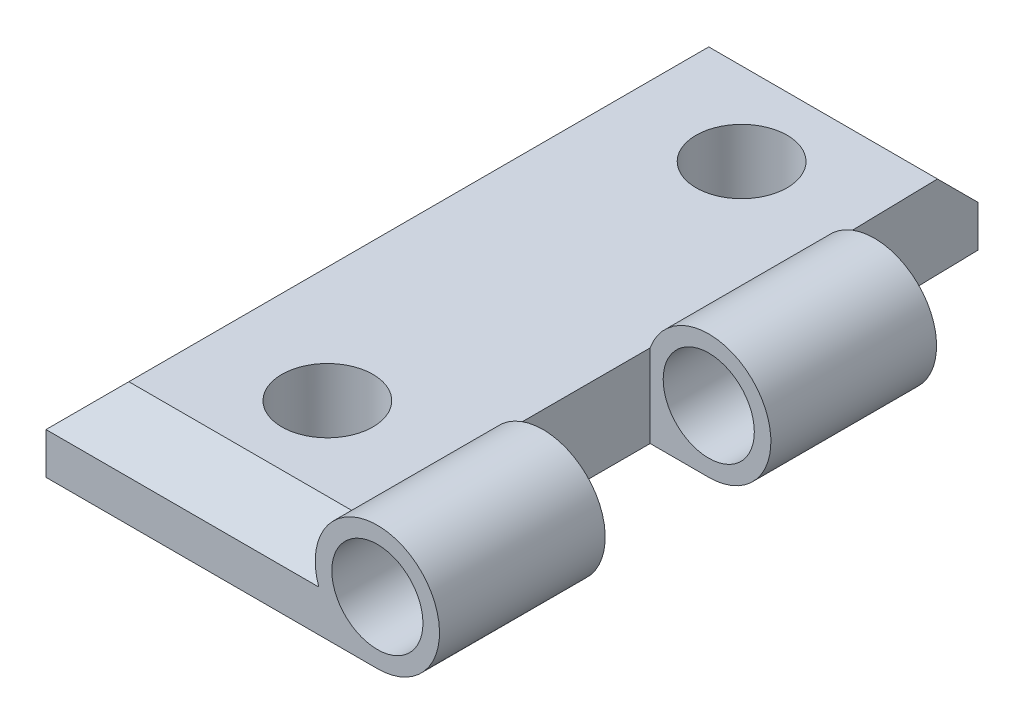
ISO-10303-21;
HEADER;
FILE_DESCRIPTION(('STEP AP214'),'2;1');
FILE_NAME('part.step','',(''),(''),'','','');
FILE_SCHEMA(('AUTOMOTIVE_DESIGN { 1 0 10303 214 1 1 1 1 }'));
ENDSEC;
DATA;
#1=APPLICATION_CONTEXT('core data for automotive mechanical design processes');
#2=APPLICATION_PROTOCOL_DEFINITION('international standard','automotive_design',2000,#1);
#3=PRODUCT_CONTEXT('',#1,'mechanical');
#4=PRODUCT('Part','Part','',(#3));
#5=PRODUCT_RELATED_PRODUCT_CATEGORY('part','',(#4));
#6=PRODUCT_DEFINITION_FORMATION('','',#4);
#7=PRODUCT_DEFINITION_CONTEXT('part definition',#1,'design');
#8=PRODUCT_DEFINITION('design','',#6,#7);
#9=PRODUCT_DEFINITION_SHAPE('','',#8);
#10=(LENGTH_UNIT() NAMED_UNIT(*) SI_UNIT(.MILLI.,.METRE.));
#11=(NAMED_UNIT(*) PLANE_ANGLE_UNIT() SI_UNIT($,.RADIAN.));
#12=(NAMED_UNIT(*) SI_UNIT($,.STERADIAN.) SOLID_ANGLE_UNIT());
#13=UNCERTAINTY_MEASURE_WITH_UNIT(LENGTH_MEASURE(1.E-05),#10,'distance_accuracy_value','');
#14=(GEOMETRIC_REPRESENTATION_CONTEXT(3) GLOBAL_UNCERTAINTY_ASSIGNED_CONTEXT((#13)) GLOBAL_UNIT_ASSIGNED_CONTEXT((#10,
#11,#12)) REPRESENTATION_CONTEXT('',''));
#15=CARTESIAN_POINT('',(0.,0.,0.));
#16=DIRECTION('',(0.,0.,1.));
#17=DIRECTION('',(1.,0.,0.));
#18=AXIS2_PLACEMENT_3D('',#15,#16,#17);
#19=CARTESIAN_POINT('',(-44.2338735713826,3.75,0.));
#20=DIRECTION('',(0.,0.,1.));
#21=DIRECTION('',(1.,0.,0.));
#22=AXIS2_PLACEMENT_3D('',#19,#20,#21);
#23=PLANE('',#22);
#24=DIRECTION('',(0.,-1.,0.));
#25=VECTOR('',#24,1.);
#26=CARTESIAN_POINT('',(-47.9838735713826,40.,0.));
#27=LINE('',#26,#25);
#28=CARTESIAN_POINT('',(-47.9838735713826,2.49999999999999,0.));
#29=VERTEX_POINT('',#28);
#30=CARTESIAN_POINT('',(-47.9838735713826,0.,0.));
#31=VERTEX_POINT('',#30);
#32=EDGE_CURVE('E60',#29,#31,#27,.T.);
#33=ORIENTED_EDGE('',*,*,#32,.T.);
#34=DIRECTION('',(1.,0.,0.));
#35=VECTOR('',#34,1.);
#36=CARTESIAN_POINT('',(-64.2338735713826,0.,0.));
#37=LINE('',#36,#35);
#38=CARTESIAN_POINT('',(-64.2338735713826,0.,0.));
#39=VERTEX_POINT('',#38);
#40=EDGE_CURVE('E137',#39,#31,#37,.T.);
#41=ORIENTED_EDGE('',*,*,#40,.F.);
#42=DIRECTION('',(0.,-1.,0.));
#43=VECTOR('',#42,1.);
#44=CARTESIAN_POINT('',(-64.2338735713826,5.,0.));
#45=LINE('',#44,#43);
#46=CARTESIAN_POINT('',(-64.2338735713826,2.49999999999999,0.));
#47=VERTEX_POINT('',#46);
#48=EDGE_CURVE('E152',#47,#39,#45,.T.);
#49=ORIENTED_EDGE('',*,*,#48,.F.);
#50=DIRECTION('',(1.,0.,0.));
#51=VECTOR('',#50,1.);
#52=CARTESIAN_POINT('',(-44.2338735713826,2.49999999999999,0.));
#53=LINE('',#52,#51);
#54=EDGE_CURVE('E139',#47,#29,#53,.T.);
#55=ORIENTED_EDGE('',*,*,#54,.T.);
#56=EDGE_LOOP('',(#33,#41,#49,#55));
#57=FACE_BOUND('',#56,.T.);
#58=ADVANCED_FACE('F41',(#57),#23,.F.);
#59=CARTESIAN_POINT('',(-44.2338735713826,3.75,40.));
#60=DIRECTION('',(0.,0.,-1.));
#61=DIRECTION('',(-1.,0.,0.));
#62=AXIS2_PLACEMENT_3D('',#59,#60,#61);
#63=CYLINDRICAL_SURFACE('',#62,3.75);
#64=CARTESIAN_POINT('',(-44.2338735713826,3.75,20.));
#65=DIRECTION('',(0.,0.,1.));
#66=DIRECTION('',(1.,0.,0.));
#67=AXIS2_PLACEMENT_3D('',#64,#65,#66);
#68=CIRCLE('',#67,3.75);
#69=CARTESIAN_POINT('',(-44.2338735713826,0.,20.));
#70=VERTEX_POINT('',#69);
#71=CARTESIAN_POINT('',(-47.7694074773153,5.,20.));
#72=VERTEX_POINT('',#71);
#73=EDGE_CURVE('E223',#70,#72,#68,.T.);
#74=ORIENTED_EDGE('',*,*,#73,.F.);
#75=DIRECTION('',(0.,0.,-1.));
#76=VECTOR('',#75,1.);
#77=CARTESIAN_POINT('',(-44.2338735713826,0.,40.));
#78=LINE('',#77,#76);
#79=CARTESIAN_POINT('',(-44.2338735713826,0.,10.));
#80=VERTEX_POINT('',#79);
#81=EDGE_CURVE('E166',#70,#80,#78,.T.);
#82=ORIENTED_EDGE('',*,*,#81,.T.);
#83=CARTESIAN_POINT('',(-44.2338735713826,3.75,10.));
#84=DIRECTION('',(0.,0.,-1.));
#85=DIRECTION('',(-1.,0.,0.));
#86=AXIS2_PLACEMENT_3D('',#83,#84,#85);
#87=CIRCLE('',#86,3.75);
#88=CARTESIAN_POINT('',(-47.7694074773153,5.,10.));
#89=VERTEX_POINT('',#88);
#90=EDGE_CURVE('E206',#89,#80,#87,.T.);
#91=ORIENTED_EDGE('',*,*,#90,.F.);
#92=DIRECTION('',(0.,0.,-1.));
#93=VECTOR('',#92,1.);
#94=CARTESIAN_POINT('',(-47.7694074773153,5.,40.));
#95=LINE('',#94,#93);
#96=EDGE_CURVE('E168',#72,#89,#95,.T.);
#97=ORIENTED_EDGE('',*,*,#96,.F.);
#98=EDGE_LOOP('',(#74,#82,#91,#97));
#99=FACE_BOUND('',#98,.T.);
#100=ADVANCED_FACE('F295',(#99),#63,.T.);
#101=CARTESIAN_POINT('',(-44.2338735713826,3.75,30.));
#102=DIRECTION('',(0.,0.,-1.));
#103=DIRECTION('',(-1.,0.,0.));
#104=AXIS2_PLACEMENT_3D('',#101,#102,#103);
#105=CIRCLE('',#104,3.75);
#106=CARTESIAN_POINT('',(-47.7694074773153,5.,30.));
#107=VERTEX_POINT('',#106);
#108=CARTESIAN_POINT('',(-44.2338735713826,0.,30.));
#109=VERTEX_POINT('',#108);
#110=EDGE_CURVE('E211',#107,#109,#105,.T.);
#111=ORIENTED_EDGE('',*,*,#110,.F.);
#112=CARTESIAN_POINT('',(-47.7694074773153,5.,37.5));
#113=VERTEX_POINT('',#112);
#114=EDGE_CURVE('E162',#113,#107,#95,.T.);
#115=ORIENTED_EDGE('',*,*,#114,.F.);
#116=CARTESIAN_POINT('',(-44.2338735713826,3.75,38.75));
#117=DIRECTION('',(0.,0.707106781186548,0.707106781186546));
#118=DIRECTION('',(0.,0.707106781186547,-0.707106781186549));
#119=AXIS2_PLACEMENT_3D('',#116,#117,#118);
#120=ELLIPSE('',#119,5.30330085889912,3.75);
#121=CARTESIAN_POINT('',(-47.7694074773153,2.49999999999999,40.));
#122=VERTEX_POINT('',#121);
#123=EDGE_CURVE('E52',#113,#122,#120,.T.);
#124=ORIENTED_EDGE('',*,*,#123,.T.);
#125=CARTESIAN_POINT('',(-44.2338735713826,3.75,40.));
#126=DIRECTION('',(0.,0.,1.));
#127=DIRECTION('',(1.,0.,0.));
#128=AXIS2_PLACEMENT_3D('',#125,#126,#127);
#129=CIRCLE('',#128,3.75);
#130=CARTESIAN_POINT('',(-44.2338735713826,0.,40.));
#131=VERTEX_POINT('',#130);
#132=EDGE_CURVE('E67',#131,#122,#129,.T.);
#133=ORIENTED_EDGE('',*,*,#132,.F.);
#134=EDGE_CURVE('E169',#131,#109,#78,.T.);
#135=ORIENTED_EDGE('',*,*,#134,.T.);
#136=EDGE_LOOP('',(#111,#115,#124,#133,#135));
#137=FACE_BOUND('',#136,.T.);
#138=ADVANCED_FACE('F265',(#137),#63,.T.);
#139=CARTESIAN_POINT('',(-44.2338735713826,3.75,40.));
#140=DIRECTION('',(0.,0.,-1.));
#141=DIRECTION('',(-1.,0.,0.));
#142=AXIS2_PLACEMENT_3D('',#139,#140,#141);
#143=CYLINDRICAL_SURFACE('',#142,2.74999999999999);
#144=CARTESIAN_POINT('',(-44.2338735713826,3.75,40.));
#145=DIRECTION('',(0.,0.,1.));
#146=DIRECTION('',(1.,0.,0.));
#147=AXIS2_PLACEMENT_3D('',#144,#145,#146);
#148=CIRCLE('',#147,2.74999999999999);
#149=CARTESIAN_POINT('',(-41.4838735713826,3.75,40.));
#150=VERTEX_POINT('',#149);
#151=EDGE_CURVE('E158',#150,#150,#148,.T.);
#152=ORIENTED_EDGE('',*,*,#151,.T.);
#153=EDGE_LOOP('',(#152));
#154=FACE_BOUND('',#153,.T.);
#155=CARTESIAN_POINT('',(-44.2338735713826,3.75,30.));
#156=DIRECTION('',(0.,0.,-1.));
#157=DIRECTION('',(-1.,0.,0.));
#158=AXIS2_PLACEMENT_3D('',#155,#156,#157);
#159=CIRCLE('',#158,2.74999999999999);
#160=CARTESIAN_POINT('',(-46.9838735713826,3.75,30.));
#161=VERTEX_POINT('',#160);
#162=EDGE_CURVE('E208',#161,#161,#159,.T.);
#163=ORIENTED_EDGE('',*,*,#162,.T.);
#164=EDGE_LOOP('',(#163));
#165=FACE_BOUND('',#164,.T.);
#166=ADVANCED_FACE('F303',(#154,#165),#143,.F.);
#167=CARTESIAN_POINT('',(-64.2338735713826,5.,2.50000000000002));
#168=DIRECTION('',(0.,-0.707106781186548,0.707106781186546));
#169=DIRECTION('',(-1.,0.,0.));
#170=AXIS2_PLACEMENT_3D('',#167,#168,#169);
#171=PLANE('',#170);
#172=DIRECTION('',(-1.,0.,0.));
#173=VECTOR('',#172,1.);
#174=CARTESIAN_POINT('',(-64.2338735713826,5.,2.50000000000002));
#175=LINE('',#174,#173);
#176=CARTESIAN_POINT('',(-47.9302570478658,5.,2.50000000000002));
#177=VERTEX_POINT('',#176);
#178=CARTESIAN_POINT('',(-61.7338735713826,5.,2.50000000000002));
#179=VERTEX_POINT('',#178);
#180=EDGE_CURVE('E181',#177,#179,#175,.T.);
#181=ORIENTED_EDGE('',*,*,#180,.F.);
#182=DIRECTION('',(0.0151632994285551,0.707025485520302,0.707025485520304));
#183=VECTOR('',#182,1.);
#184=CARTESIAN_POINT('',(-47.9340056674851,4.82521154984194,2.32521154984195));
#185=LINE('',#184,#183);
#186=EDGE_CURVE('E11',#177,#29,#185,.F.);
#187=ORIENTED_EDGE('',*,*,#186,.T.);
#188=ORIENTED_EDGE('',*,*,#54,.F.);
#189=DIRECTION('',(-0.577350269189626,-0.577350269189625,-0.577350269189626));
#190=VECTOR('',#189,1.);
#191=CARTESIAN_POINT('',(-50.9005402380492,15.8333333333333,13.3333333333334));
#192=LINE('',#191,#190);
#193=EDGE_CURVE('E195',#47,#179,#192,.F.);
#194=ORIENTED_EDGE('',*,*,#193,.T.);
#195=EDGE_LOOP('',(#181,#187,#188,#194));
#196=FACE_BOUND('',#195,.T.);
#197=ADVANCED_FACE('F318',(#196),#171,.F.);
#198=CARTESIAN_POINT('',(-44.2338735713826,3.75,40.));
#199=DIRECTION('',(0.,0.,1.));
#200=DIRECTION('',(1.,0.,0.));
#201=AXIS2_PLACEMENT_3D('',#198,#199,#200);
#202=PLANE('',#201);
#203=ORIENTED_EDGE('',*,*,#132,.T.);
#204=DIRECTION('',(-1.,0.,0.));
#205=VECTOR('',#204,1.);
#206=CARTESIAN_POINT('',(-64.2338735713826,2.49999999999999,40.));
#207=LINE('',#206,#205);
#208=CARTESIAN_POINT('',(-64.2338735713826,2.49999999999999,40.));
#209=VERTEX_POINT('',#208);
#210=EDGE_CURVE('E190',#122,#209,#207,.T.);
#211=ORIENTED_EDGE('',*,*,#210,.T.);
#212=DIRECTION('',(0.,-1.,0.));
#213=VECTOR('',#212,1.);
#214=CARTESIAN_POINT('',(-64.2338735713826,5.,40.));
#215=LINE('',#214,#213);
#216=CARTESIAN_POINT('',(-64.2338735713826,0.,40.));
#217=VERTEX_POINT('',#216);
#218=EDGE_CURVE('E151',#209,#217,#215,.T.);
#219=ORIENTED_EDGE('',*,*,#218,.T.);
#220=DIRECTION('',(1.,0.,0.));
#221=VECTOR('',#220,1.);
#222=CARTESIAN_POINT('',(-64.2338735713826,0.,40.));
#223=LINE('',#222,#221);
#224=EDGE_CURVE('E156',#217,#131,#223,.T.);
#225=ORIENTED_EDGE('',*,*,#224,.T.);
#226=EDGE_LOOP('',(#203,#211,#219,#225));
#227=FACE_BOUND('',#226,.T.);
#228=ORIENTED_EDGE('',*,*,#151,.F.);
#229=EDGE_LOOP('',(#228));
#230=FACE_BOUND('',#229,.T.);
#231=ADVANCED_FACE('F315',(#227,#230),#202,.T.);
#232=CARTESIAN_POINT('',(-64.2338735713826,5.,40.));
#233=DIRECTION('',(0.,-1.,0.));
#234=DIRECTION('',(0.,0.,-1.));
#235=AXIS2_PLACEMENT_3D('',#232,#233,#234);
#236=PLANE('',#235);
#237=CARTESIAN_POINT('',(-54.751640524349,5.,7.5));
#238=DIRECTION('',(0.,-1.,0.));
#239=DIRECTION('',(0.,0.,-1.));
#240=AXIS2_PLACEMENT_3D('',#237,#238,#239);
#241=CIRCLE('',#240,2.75);
#242=CARTESIAN_POINT('',(-54.751640524349,5.,4.75));
#243=VERTEX_POINT('',#242);
#244=EDGE_CURVE('E199',#243,#243,#241,.F.);
#245=ORIENTED_EDGE('',*,*,#244,.F.);
#246=EDGE_LOOP('',(#245));
#247=FACE_BOUND('',#246,.T.);
#248=DIRECTION('',(0.0214416788478935,0.,0.999770100777266));
#249=VECTOR('',#248,1.);
#250=CARTESIAN_POINT('',(-47.1338744603459,5.,39.6332629982102));
#251=LINE('',#250,#249);
#252=EDGE_CURVE('E207',#177,#89,#251,.T.);
#253=ORIENTED_EDGE('',*,*,#252,.F.);
#254=ORIENTED_EDGE('',*,*,#180,.T.);
#255=DIRECTION('',(0.,0.,1.));
#256=VECTOR('',#255,1.);
#257=CARTESIAN_POINT('',(-61.7338735713826,5.,40.));
#258=LINE('',#257,#256);
#259=CARTESIAN_POINT('',(-61.7338735713826,5.,37.5));
#260=VERTEX_POINT('',#259);
#261=EDGE_CURVE('E178',#179,#260,#258,.T.);
#262=ORIENTED_EDGE('',*,*,#261,.T.);
#263=DIRECTION('',(1.,0.,0.));
#264=VECTOR('',#263,1.);
#265=CARTESIAN_POINT('',(-47.7694074773153,5.,37.5));
#266=LINE('',#265,#264);
#267=EDGE_CURVE('E175',#260,#113,#266,.T.);
#268=ORIENTED_EDGE('',*,*,#267,.T.);
#269=ORIENTED_EDGE('',*,*,#114,.T.);
#270=EDGE_CURVE('E167',#107,#72,#95,.T.);
#271=ORIENTED_EDGE('',*,*,#270,.T.);
#272=ORIENTED_EDGE('',*,*,#96,.T.);
#273=EDGE_LOOP('',(#253,#254,#262,#268,#269,#271,#272));
#274=FACE_BOUND('',#273,.T.);
#275=CARTESIAN_POINT('',(-54.7516405243489,5.,32.5));
#276=DIRECTION('',(0.,-1.,0.));
#277=DIRECTION('',(0.,0.,-1.));
#278=AXIS2_PLACEMENT_3D('',#275,#276,#277);
#279=CIRCLE('',#278,2.75);
#280=CARTESIAN_POINT('',(-54.7516405243489,5.,29.75));
#281=VERTEX_POINT('',#280);
#282=EDGE_CURVE('E226',#281,#281,#279,.F.);
#283=ORIENTED_EDGE('',*,*,#282,.F.);
#284=EDGE_LOOP('',(#283));
#285=FACE_BOUND('',#284,.T.);
#286=ADVANCED_FACE('F245',(#247,#274,#285),#236,.F.);
#287=CARTESIAN_POINT('',(-64.2338735713826,5.,40.));
#288=DIRECTION('',(1.,0.,0.));
#289=DIRECTION('',(0.,0.,-1.));
#290=AXIS2_PLACEMENT_3D('',#287,#288,#289);
#291=PLANE('',#290);
#292=ORIENTED_EDGE('',*,*,#218,.F.);
#293=DIRECTION('',(0.,0.,-1.));
#294=VECTOR('',#293,1.);
#295=CARTESIAN_POINT('',(-64.2338735713826,2.49999999999999,40.));
#296=LINE('',#295,#294);
#297=EDGE_CURVE('E187',#209,#47,#296,.T.);
#298=ORIENTED_EDGE('',*,*,#297,.T.);
#299=ORIENTED_EDGE('',*,*,#48,.T.);
#300=DIRECTION('',(0.,0.,-1.));
#301=VECTOR('',#300,1.);
#302=CARTESIAN_POINT('',(-64.2338735713826,0.,40.));
#303=LINE('',#302,#301);
#304=EDGE_CURVE('E149',#217,#39,#303,.T.);
#305=ORIENTED_EDGE('',*,*,#304,.F.);
#306=EDGE_LOOP('',(#292,#298,#299,#305));
#307=FACE_BOUND('',#306,.T.);
#308=ADVANCED_FACE('F309',(#307),#291,.F.);
#309=CARTESIAN_POINT('',(-64.2338735713826,0.,40.));
#310=DIRECTION('',(0.,1.,0.));
#311=DIRECTION('',(0.,0.,1.));
#312=AXIS2_PLACEMENT_3D('',#309,#310,#311);
#313=PLANE('',#312);
#314=CARTESIAN_POINT('',(-54.751640524349,0.,7.5));
#315=DIRECTION('',(0.,1.,0.));
#316=DIRECTION('',(0.,0.,1.));
#317=AXIS2_PLACEMENT_3D('',#314,#315,#316);
#318=CIRCLE('',#317,2.75);
#319=CARTESIAN_POINT('',(-54.751640524349,0.,10.25));
#320=VERTEX_POINT('',#319);
#321=EDGE_CURVE('E276',#320,#320,#318,.T.);
#322=ORIENTED_EDGE('',*,*,#321,.T.);
#323=EDGE_LOOP('',(#322));
#324=FACE_BOUND('',#323,.T.);
#325=DIRECTION('',(-1.,0.,0.));
#326=VECTOR('',#325,1.);
#327=CARTESIAN_POINT('',(-47.7694074773153,0.,20.));
#328=LINE('',#327,#326);
#329=CARTESIAN_POINT('',(-47.7694074773153,0.,20.));
#330=VERTEX_POINT('',#329);
#331=EDGE_CURVE('E141',#70,#330,#328,.T.);
#332=ORIENTED_EDGE('',*,*,#331,.T.);
#333=DIRECTION('',(0.,0.,1.));
#334=VECTOR('',#333,1.);
#335=CARTESIAN_POINT('',(-47.7694074773153,0.,30.));
#336=LINE('',#335,#334);
#337=CARTESIAN_POINT('',(-47.7694074773153,0.,30.));
#338=VERTEX_POINT('',#337);
#339=EDGE_CURVE('E268',#330,#338,#336,.T.);
#340=ORIENTED_EDGE('',*,*,#339,.T.);
#341=DIRECTION('',(1.,0.,0.));
#342=VECTOR('',#341,1.);
#343=CARTESIAN_POINT('',(-40.4838735713826,0.,30.));
#344=LINE('',#343,#342);
#345=EDGE_CURVE('E260',#338,#109,#344,.T.);
#346=ORIENTED_EDGE('',*,*,#345,.T.);
#347=ORIENTED_EDGE('',*,*,#134,.F.);
#348=ORIENTED_EDGE('',*,*,#224,.F.);
#349=ORIENTED_EDGE('',*,*,#304,.T.);
#350=ORIENTED_EDGE('',*,*,#40,.T.);
#351=DIRECTION('',(0.0214416788478935,0.,0.999770100777265));
#352=VECTOR('',#351,1.);
#353=CARTESIAN_POINT('',(-47.9838735713826,0.,0.));
#354=LINE('',#353,#352);
#355=CARTESIAN_POINT('',(-47.7694074773153,0.,10.));
#356=VERTEX_POINT('',#355);
#357=EDGE_CURVE('E122',#31,#356,#354,.T.);
#358=ORIENTED_EDGE('',*,*,#357,.T.);
#359=DIRECTION('',(1.,0.,0.));
#360=VECTOR('',#359,1.);
#361=CARTESIAN_POINT('',(-47.7694074773153,0.,10.));
#362=LINE('',#361,#360);
#363=EDGE_CURVE('E131',#356,#80,#362,.T.);
#364=ORIENTED_EDGE('',*,*,#363,.T.);
#365=ORIENTED_EDGE('',*,*,#81,.F.);
#366=EDGE_LOOP('',(#332,#340,#346,#347,#348,#349,#350,#358,#364,#365));
#367=FACE_BOUND('',#366,.T.);
#368=CARTESIAN_POINT('',(-54.7516405243489,0.,32.5));
#369=DIRECTION('',(0.,1.,0.));
#370=DIRECTION('',(0.,0.,1.));
#371=AXIS2_PLACEMENT_3D('',#368,#369,#370);
#372=CIRCLE('',#371,2.75);
#373=CARTESIAN_POINT('',(-54.7516405243489,0.,35.25));
#374=VERTEX_POINT('',#373);
#375=EDGE_CURVE('E277',#374,#374,#372,.T.);
#376=ORIENTED_EDGE('',*,*,#375,.T.);
#377=EDGE_LOOP('',(#376));
#378=FACE_BOUND('',#377,.T.);
#379=ADVANCED_FACE('F145',(#324,#367,#378),#313,.F.);
#380=CARTESIAN_POINT('',(-44.2338735713826,2.49999999999999,40.));
#381=DIRECTION('',(0.,0.707106781186548,0.707106781186546));
#382=DIRECTION('',(1.,0.,0.));
#383=AXIS2_PLACEMENT_3D('',#380,#381,#382);
#384=PLANE('',#383);
#385=ORIENTED_EDGE('',*,*,#123,.F.);
#386=ORIENTED_EDGE('',*,*,#267,.F.);
#387=DIRECTION('',(0.577350269189626,0.577350269189625,-0.577350269189626));
#388=VECTOR('',#387,1.);
#389=CARTESIAN_POINT('',(-57.5672069047159,9.16666666666665,33.3333333333333));
#390=LINE('',#389,#388);
#391=EDGE_CURVE('E198',#209,#260,#390,.T.);
#392=ORIENTED_EDGE('',*,*,#391,.F.);
#393=ORIENTED_EDGE('',*,*,#210,.F.);
#394=EDGE_LOOP('',(#385,#386,#392,#393));
#395=FACE_BOUND('',#394,.T.);
#396=ADVANCED_FACE('F44',(#395),#384,.T.);
#397=CARTESIAN_POINT('',(-64.2338735713826,2.49999999999999,40.));
#398=DIRECTION('',(0.707106781186546,-0.707106781186548,0.));
#399=DIRECTION('',(0.,0.,-1.));
#400=AXIS2_PLACEMENT_3D('',#397,#398,#399);
#401=PLANE('',#400);
#402=ORIENTED_EDGE('',*,*,#391,.T.);
#403=ORIENTED_EDGE('',*,*,#261,.F.);
#404=ORIENTED_EDGE('',*,*,#193,.F.);
#405=ORIENTED_EDGE('',*,*,#297,.F.);
#406=EDGE_LOOP('',(#402,#403,#404,#405));
#407=FACE_BOUND('',#406,.T.);
#408=ADVANCED_FACE('F324',(#407),#401,.F.);
#409=CARTESIAN_POINT('',(-47.7694074773153,40.,10.));
#410=DIRECTION('',(0.,0.,-1.));
#411=DIRECTION('',(-1.,0.,0.));
#412=AXIS2_PLACEMENT_3D('',#409,#410,#411);
#413=PLANE('',#412);
#414=CARTESIAN_POINT('',(-44.2338735713826,3.75,10.));
#415=DIRECTION('',(0.,0.,-1.));
#416=DIRECTION('',(-1.,0.,0.));
#417=AXIS2_PLACEMENT_3D('',#414,#415,#416);
#418=CIRCLE('',#417,2.74999999999999);
#419=CARTESIAN_POINT('',(-46.9838735713826,3.75,10.));
#420=VERTEX_POINT('',#419);
#421=EDGE_CURVE('E203',#420,#420,#418,.T.);
#422=ORIENTED_EDGE('',*,*,#421,.F.);
#423=EDGE_LOOP('',(#422));
#424=FACE_BOUND('',#423,.T.);
#425=ORIENTED_EDGE('',*,*,#90,.T.);
#426=ORIENTED_EDGE('',*,*,#363,.F.);
#427=DIRECTION('',(0.,-1.,0.));
#428=VECTOR('',#427,1.);
#429=CARTESIAN_POINT('',(-47.7694074773153,40.,10.));
#430=LINE('',#429,#428);
#431=EDGE_CURVE('E125',#89,#356,#430,.T.);
#432=ORIENTED_EDGE('',*,*,#431,.F.);
#433=EDGE_LOOP('',(#425,#426,#432));
#434=FACE_BOUND('',#433,.T.);
#435=ADVANCED_FACE('F328',(#424,#434),#413,.T.);
#436=CARTESIAN_POINT('',(-47.9838735713826,40.,0.));
#437=DIRECTION('',(0.999770100777265,0.,-0.0214416788478935));
#438=DIRECTION('',(-0.0214416788478935,0.,-0.999770100777266));
#439=AXIS2_PLACEMENT_3D('',#436,#437,#438);
#440=PLANE('',#439);
#441=ORIENTED_EDGE('',*,*,#186,.F.);
#442=ORIENTED_EDGE('',*,*,#252,.T.);
#443=ORIENTED_EDGE('',*,*,#431,.T.);
#444=ORIENTED_EDGE('',*,*,#357,.F.);
#445=ORIENTED_EDGE('',*,*,#32,.F.);
#446=EDGE_LOOP('',(#441,#442,#443,#444,#445));
#447=FACE_BOUND('',#446,.T.);
#448=ADVANCED_FACE('F123',(#447),#440,.T.);
#449=ORIENTED_EDGE('',*,*,#421,.T.);
#450=EDGE_LOOP('',(#449));
#451=FACE_BOUND('',#450,.T.);
#452=CARTESIAN_POINT('',(-44.2338735713826,3.75,20.));
#453=DIRECTION('',(0.,0.,1.));
#454=DIRECTION('',(1.,0.,0.));
#455=AXIS2_PLACEMENT_3D('',#452,#453,#454);
#456=CIRCLE('',#455,2.74999999999999);
#457=CARTESIAN_POINT('',(-41.4838735713826,3.75,20.));
#458=VERTEX_POINT('',#457);
#459=EDGE_CURVE('E46',#458,#458,#456,.T.);
#460=ORIENTED_EDGE('',*,*,#459,.T.);
#461=EDGE_LOOP('',(#460));
#462=FACE_BOUND('',#461,.T.);
#463=ADVANCED_FACE('F354',(#451,#462),#143,.F.);
#464=CARTESIAN_POINT('',(-47.7694074773153,40.,30.));
#465=DIRECTION('',(1.,0.,0.));
#466=DIRECTION('',(0.,0.,-1.));
#467=AXIS2_PLACEMENT_3D('',#464,#465,#466);
#468=PLANE('',#467);
#469=ORIENTED_EDGE('',*,*,#270,.F.);
#470=DIRECTION('',(0.,-1.,0.));
#471=VECTOR('',#470,1.);
#472=CARTESIAN_POINT('',(-47.7694074773153,40.,30.));
#473=LINE('',#472,#471);
#474=EDGE_CURVE('E253',#107,#338,#473,.T.);
#475=ORIENTED_EDGE('',*,*,#474,.T.);
#476=ORIENTED_EDGE('',*,*,#339,.F.);
#477=DIRECTION('',(0.,-1.,0.));
#478=VECTOR('',#477,1.);
#479=CARTESIAN_POINT('',(-47.7694074773153,40.,20.));
#480=LINE('',#479,#478);
#481=EDGE_CURVE('E255',#72,#330,#480,.T.);
#482=ORIENTED_EDGE('',*,*,#481,.F.);
#483=EDGE_LOOP('',(#469,#475,#476,#482));
#484=FACE_BOUND('',#483,.T.);
#485=ADVANCED_FACE('F251',(#484),#468,.T.);
#486=CARTESIAN_POINT('',(-47.7694074773153,40.,20.));
#487=DIRECTION('',(0.,0.,1.));
#488=DIRECTION('',(1.,0.,0.));
#489=AXIS2_PLACEMENT_3D('',#486,#487,#488);
#490=PLANE('',#489);
#491=ORIENTED_EDGE('',*,*,#459,.F.);
#492=EDGE_LOOP('',(#491));
#493=FACE_BOUND('',#492,.T.);
#494=ORIENTED_EDGE('',*,*,#73,.T.);
#495=ORIENTED_EDGE('',*,*,#481,.T.);
#496=ORIENTED_EDGE('',*,*,#331,.F.);
#497=EDGE_LOOP('',(#494,#495,#496));
#498=FACE_BOUND('',#497,.T.);
#499=ADVANCED_FACE('F293',(#493,#498),#490,.T.);
#500=CARTESIAN_POINT('',(-40.4838735713826,40.,30.));
#501=DIRECTION('',(0.,0.,-1.));
#502=DIRECTION('',(-1.,0.,0.));
#503=AXIS2_PLACEMENT_3D('',#500,#501,#502);
#504=PLANE('',#503);
#505=ORIENTED_EDGE('',*,*,#162,.F.);
#506=EDGE_LOOP('',(#505));
#507=FACE_BOUND('',#506,.T.);
#508=ORIENTED_EDGE('',*,*,#110,.T.);
#509=ORIENTED_EDGE('',*,*,#345,.F.);
#510=ORIENTED_EDGE('',*,*,#474,.F.);
#511=EDGE_LOOP('',(#508,#509,#510));
#512=FACE_BOUND('',#511,.T.);
#513=ADVANCED_FACE('F258',(#507,#512),#504,.T.);
#514=CARTESIAN_POINT('',(-54.7516405243489,40.,32.5));
#515=DIRECTION('',(0.,-1.,0.));
#516=DIRECTION('',(0.,0.,-1.));
#517=AXIS2_PLACEMENT_3D('',#514,#515,#516);
#518=CYLINDRICAL_SURFACE('',#517,2.75);
#519=ORIENTED_EDGE('',*,*,#375,.F.);
#520=EDGE_LOOP('',(#519));
#521=FACE_BOUND('',#520,.T.);
#522=ORIENTED_EDGE('',*,*,#282,.T.);
#523=EDGE_LOOP('',(#522));
#524=FACE_BOUND('',#523,.T.);
#525=ADVANCED_FACE('F377',(#521,#524),#518,.F.);
#526=CARTESIAN_POINT('',(-54.751640524349,40.,7.5));
#527=DIRECTION('',(0.,-1.,0.));
#528=DIRECTION('',(0.,0.,-1.));
#529=AXIS2_PLACEMENT_3D('',#526,#527,#528);
#530=CYLINDRICAL_SURFACE('',#529,2.75);
#531=ORIENTED_EDGE('',*,*,#321,.F.);
#532=EDGE_LOOP('',(#531));
#533=FACE_BOUND('',#532,.T.);
#534=ORIENTED_EDGE('',*,*,#244,.T.);
#535=EDGE_LOOP('',(#534));
#536=FACE_BOUND('',#535,.T.);
#537=ADVANCED_FACE('F381',(#533,#536),#530,.F.);
#538=CLOSED_SHELL('',(#58,#100,#138,#166,#197,#231,#286,#308,#379,#396,#408,#435,#448,#463,#485,
#499,#513,#525,#537));
#539=MANIFOLD_SOLID_BREP('B2',#538);
#540=ADVANCED_BREP_SHAPE_REPRESENTATION('',(#18,#539),#14);
#541=SHAPE_DEFINITION_REPRESENTATION(#9,#540);
ENDSEC;
END-ISO-10303-21;
